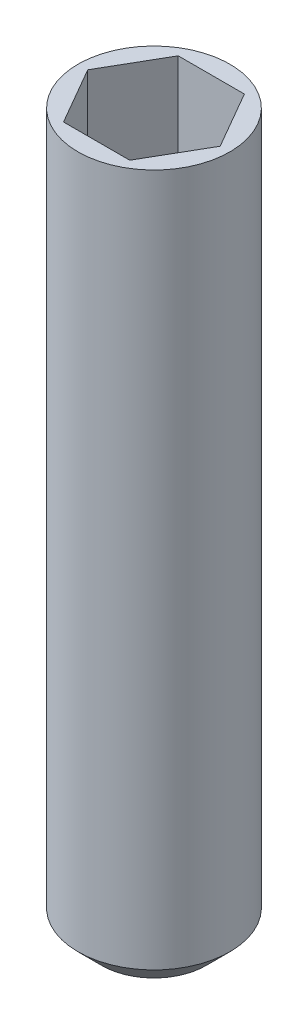
ISO-10303-21;
HEADER;
FILE_DESCRIPTION(('STEP AP214'),'2;1');
FILE_NAME('part.step','',(''),(''),'','','');
FILE_SCHEMA(('AUTOMOTIVE_DESIGN { 1 0 10303 214 1 1 1 1 }'));
ENDSEC;
DATA;
#1=APPLICATION_CONTEXT('core data for automotive mechanical design processes');
#2=APPLICATION_PROTOCOL_DEFINITION('international standard','automotive_design',2000,#1);
#3=PRODUCT_CONTEXT('',#1,'mechanical');
#4=PRODUCT('Part','Part','',(#3));
#5=PRODUCT_RELATED_PRODUCT_CATEGORY('part','',(#4));
#6=PRODUCT_DEFINITION_FORMATION('','',#4);
#7=PRODUCT_DEFINITION_CONTEXT('part definition',#1,'design');
#8=PRODUCT_DEFINITION('design','',#6,#7);
#9=PRODUCT_DEFINITION_SHAPE('','',#8);
#10=(LENGTH_UNIT() NAMED_UNIT(*) SI_UNIT(.MILLI.,.METRE.));
#11=(NAMED_UNIT(*) PLANE_ANGLE_UNIT() SI_UNIT($,.RADIAN.));
#12=(NAMED_UNIT(*) SI_UNIT($,.STERADIAN.) SOLID_ANGLE_UNIT());
#13=UNCERTAINTY_MEASURE_WITH_UNIT(LENGTH_MEASURE(1.E-05),#10,'distance_accuracy_value','');
#14=(GEOMETRIC_REPRESENTATION_CONTEXT(3) GLOBAL_UNCERTAINTY_ASSIGNED_CONTEXT((#13)) GLOBAL_UNIT_ASSIGNED_CONTEXT((#10,
#11,#12)) REPRESENTATION_CONTEXT('',''));
#15=CARTESIAN_POINT('',(0.,0.,0.));
#16=DIRECTION('',(0.,0.,1.));
#17=DIRECTION('',(1.,0.,0.));
#18=AXIS2_PLACEMENT_3D('',#15,#16,#17);
#19=CARTESIAN_POINT('',(0.,-19.05,0.));
#20=DIRECTION('',(0.,1.,0.));
#21=DIRECTION('',(0.,0.,1.));
#22=AXIS2_PLACEMENT_3D('',#19,#20,#21);
#23=CYLINDRICAL_SURFACE('',#22,2.0193);
#24=CARTESIAN_POINT('',(0.,-18.415,0.));
#25=DIRECTION('',(0.,1.,0.));
#26=DIRECTION('',(0.,0.,1.));
#27=AXIS2_PLACEMENT_3D('',#24,#25,#26);
#28=CIRCLE('',#27,2.0193);
#29=CARTESIAN_POINT('',(0.,-18.415,2.0193));
#30=VERTEX_POINT('',#29);
#31=EDGE_CURVE('E41',#30,#30,#28,.T.);
#32=CARTESIAN_POINT('',(0.,0.,0.));
#33=DIRECTION('',(0.,1.,0.));
#34=DIRECTION('',(0.,0.,1.));
#35=AXIS2_PLACEMENT_3D('',#32,#33,#34);
#36=CIRCLE('',#35,2.0193);
#37=CARTESIAN_POINT('',(0.,0.,2.0193));
#38=VERTEX_POINT('',#37);
#39=EDGE_CURVE('E135',#38,#38,#36,.T.);
#40=CARTESIAN_POINT('',(0.,-18.415,2.0193));
#41=CARTESIAN_POINT('',(0.,-18.2231770833333,2.0193));
#42=CARTESIAN_POINT('',(0.,-18.0313541666667,2.0193));
#43=CARTESIAN_POINT('',(0.,-17.6477083333333,2.0193));
#44=CARTESIAN_POINT('',(0.,-17.4558854166667,2.0193));
#45=CARTESIAN_POINT('',(0.,-17.0722395833333,2.0193));
#46=CARTESIAN_POINT('',(0.,-16.8804166666667,2.0193));
#47=CARTESIAN_POINT('',(0.,-16.4967708333333,2.0193));
#48=CARTESIAN_POINT('',(0.,-16.3049479166667,2.0193));
#49=CARTESIAN_POINT('',(0.,-15.9213020833333,2.0193));
#50=CARTESIAN_POINT('',(0.,-15.7294791666667,2.0193));
#51=CARTESIAN_POINT('',(0.,-15.3458333333333,2.0193));
#52=CARTESIAN_POINT('',(0.,-15.1540104166667,2.0193));
#53=CARTESIAN_POINT('',(0.,-14.7703645833333,2.0193));
#54=CARTESIAN_POINT('',(0.,-14.5785416666667,2.0193));
#55=CARTESIAN_POINT('',(0.,-14.1948958333333,2.0193));
#56=CARTESIAN_POINT('',(0.,-14.0030729166667,2.0193));
#57=CARTESIAN_POINT('',(0.,-13.6194270833333,2.0193));
#58=CARTESIAN_POINT('',(0.,-13.4276041666667,2.0193));
#59=CARTESIAN_POINT('',(0.,-13.0439583333333,2.0193));
#60=CARTESIAN_POINT('',(0.,-12.8521354166667,2.0193));
#61=CARTESIAN_POINT('',(0.,-12.4684895833333,2.0193));
#62=CARTESIAN_POINT('',(0.,-12.2766666666667,2.0193));
#63=CARTESIAN_POINT('',(0.,-11.8930208333333,2.0193));
#64=CARTESIAN_POINT('',(0.,-11.7011979166667,2.0193));
#65=CARTESIAN_POINT('',(0.,-11.3175520833333,2.0193));
#66=CARTESIAN_POINT('',(0.,-11.1257291666667,2.0193));
#67=CARTESIAN_POINT('',(0.,-10.7420833333333,2.0193));
#68=CARTESIAN_POINT('',(0.,-10.5502604166667,2.0193));
#69=CARTESIAN_POINT('',(0.,-10.1666145833333,2.0193));
#70=CARTESIAN_POINT('',(0.,-9.97479166666666,2.0193));
#71=CARTESIAN_POINT('',(0.,-9.59114583333333,2.0193));
#72=CARTESIAN_POINT('',(0.,-9.39932291666666,2.0193));
#73=CARTESIAN_POINT('',(0.,-9.01567708333333,2.0193));
#74=CARTESIAN_POINT('',(0.,-8.82385416666666,2.0193));
#75=CARTESIAN_POINT('',(0.,-8.44020833333333,2.0193));
#76=CARTESIAN_POINT('',(0.,-8.24838541666666,2.0193));
#77=CARTESIAN_POINT('',(0.,-7.86473958333333,2.0193));
#78=CARTESIAN_POINT('',(0.,-7.67291666666666,2.0193));
#79=CARTESIAN_POINT('',(0.,-7.28927083333333,2.0193));
#80=CARTESIAN_POINT('',(0.,-7.09744791666667,2.0193));
#81=CARTESIAN_POINT('',(0.,-6.71380208333333,2.0193));
#82=CARTESIAN_POINT('',(0.,-6.52197916666666,2.0193));
#83=CARTESIAN_POINT('',(0.,-6.13833333333333,2.0193));
#84=CARTESIAN_POINT('',(0.,-5.94651041666666,2.0193));
#85=CARTESIAN_POINT('',(0.,-5.56286458333333,2.0193));
#86=CARTESIAN_POINT('',(0.,-5.37104166666667,2.0193));
#87=CARTESIAN_POINT('',(0.,-4.98739583333333,2.0193));
#88=CARTESIAN_POINT('',(0.,-4.79557291666667,2.0193));
#89=CARTESIAN_POINT('',(0.,-4.41192708333333,2.0193));
#90=CARTESIAN_POINT('',(0.,-4.22010416666666,2.0193));
#91=CARTESIAN_POINT('',(0.,-3.83645833333333,2.0193));
#92=CARTESIAN_POINT('',(0.,-3.64463541666667,2.0193));
#93=CARTESIAN_POINT('',(0.,-3.26098958333333,2.0193));
#94=CARTESIAN_POINT('',(0.,-3.06916666666667,2.0193));
#95=CARTESIAN_POINT('',(0.,-2.68552083333333,2.0193));
#96=CARTESIAN_POINT('',(0.,-2.49369791666667,2.0193));
#97=CARTESIAN_POINT('',(0.,-2.11005208333333,2.0193));
#98=CARTESIAN_POINT('',(0.,-1.91822916666667,2.0193));
#99=CARTESIAN_POINT('',(0.,-1.53458333333333,2.0193));
#100=CARTESIAN_POINT('',(0.,-1.34276041666667,2.0193));
#101=CARTESIAN_POINT('',(0.,-0.959114583333334,2.0193));
#102=CARTESIAN_POINT('',(0.,-0.767291666666666,2.0193));
#103=CARTESIAN_POINT('',(0.,-0.383645833333332,2.0193));
#104=CARTESIAN_POINT('',(0.,-0.191822916666666,2.0193));
#105=CARTESIAN_POINT('',(0.,0.,2.0193));
#106=B_SPLINE_CURVE_WITH_KNOTS('',3,(#40,#41,#42,#43,#44,#45,#46,#47,#48,#49,#50,#51,#52,#53,
#54,#55,#56,#57,#58,#59,#60,#61,#62,#63,#64,#65,#66,#67,#68,#69,#70,#71,#72,#73,#74,#75,#76,#77,
#78,#79,#80,#81,#82,#83,#84,#85,#86,#87,#88,#89,#90,#91,#92,#93,#94,#95,#96,#97,#98,#99,#100,
#101,#102,#103,#104,#105),.UNSPECIFIED.,.F.,.F.,(4,2,2,2,2,2,2,2,2,2,2,2,2,2,2,2,2,2,2,2,2,2,2,
2,2,2,2,2,2,2,2,2,4),(0.,0.575468749999999,1.1509375,1.72640625,2.301875,2.87734375,3.4528125,
4.02828125,4.60375,5.17921875,5.75468749999999,6.33015625,6.905625,7.48109374999999,
8.05656249999999,8.63203124999999,9.20749999999999,9.78296874999999,10.3584375,10.93390625,
11.509375,12.08484375,12.6603125,13.23578125,13.81125,14.38671875,14.9621875,15.53765625,
16.113125,16.68859375,17.2640625,17.83953125,18.415),.UNSPECIFIED.);
#107=EDGE_CURVE('BSEAM33',#30,#38,#106,.T.);
#108=ORIENTED_EDGE('',*,*,#31,.T.);
#109=ORIENTED_EDGE('',*,*,#39,.F.);
#110=ORIENTED_EDGE('',*,*,#107,.T.);
#111=ORIENTED_EDGE('',*,*,#107,.F.);
#112=EDGE_LOOP('',(#108,#110,#109,#111));
#113=FACE_BOUND('',#112,.T.);
#114=ADVANCED_FACE('F33',(#113),#23,.T.);
#115=CARTESIAN_POINT('',(0.,-19.05,0.));
#116=DIRECTION('',(0.,1.,0.));
#117=DIRECTION('',(0.,0.,1.));
#118=AXIS2_PLACEMENT_3D('',#115,#116,#117);
#119=PLANE('',#118);
#120=CARTESIAN_POINT('',(0.,-19.05,0.));
#121=DIRECTION('',(0.,1.,0.));
#122=DIRECTION('',(0.,0.,1.));
#123=AXIS2_PLACEMENT_3D('',#120,#121,#122);
#124=CIRCLE('',#123,1.38429999999998);
#125=CARTESIAN_POINT('',(0.,-19.05,1.38429999999998));
#126=VERTEX_POINT('',#125);
#127=EDGE_CURVE('E11',#126,#126,#124,.F.);
#128=ORIENTED_EDGE('',*,*,#127,.T.);
#129=EDGE_LOOP('',(#128));
#130=FACE_BOUND('',#129,.T.);
#131=ADVANCED_FACE('F157',(#130),#119,.F.);
#132=CARTESIAN_POINT('',(0.,0.,0.));
#133=DIRECTION('',(0.,1.,0.));
#134=DIRECTION('',(0.,0.,1.));
#135=AXIS2_PLACEMENT_3D('',#132,#133,#134);
#136=PLANE('',#135);
#137=DIRECTION('',(-0.5,0.,0.866025403784438));
#138=VECTOR('',#137,1.);
#139=CARTESIAN_POINT('',(-0.87988181024499,0.,-1.524));
#140=LINE('',#139,#138);
#141=CARTESIAN_POINT('',(-0.87988181024499,0.,-1.524));
#142=VERTEX_POINT('',#141);
#143=CARTESIAN_POINT('',(-1.75976362048998,0.,0.));
#144=VERTEX_POINT('',#143);
#145=EDGE_CURVE('E48',#142,#144,#140,.T.);
#146=ORIENTED_EDGE('',*,*,#145,.F.);
#147=DIRECTION('',(-1.,0.,0.));
#148=VECTOR('',#147,1.);
#149=CARTESIAN_POINT('',(0.87988181024499,0.,-1.524));
#150=LINE('',#149,#148);
#151=CARTESIAN_POINT('',(0.87988181024499,0.,-1.524));
#152=VERTEX_POINT('',#151);
#153=EDGE_CURVE('E131',#152,#142,#150,.T.);
#154=ORIENTED_EDGE('',*,*,#153,.F.);
#155=DIRECTION('',(-0.5,0.,-0.866025403784439));
#156=VECTOR('',#155,1.);
#157=CARTESIAN_POINT('',(1.75976362048998,0.,0.));
#158=LINE('',#157,#156);
#159=CARTESIAN_POINT('',(1.75976362048998,0.,0.));
#160=VERTEX_POINT('',#159);
#161=EDGE_CURVE('E129',#160,#152,#158,.T.);
#162=ORIENTED_EDGE('',*,*,#161,.F.);
#163=DIRECTION('',(0.5,0.,-0.866025403784439));
#164=VECTOR('',#163,1.);
#165=CARTESIAN_POINT('',(0.879881810244989,0.,1.524));
#166=LINE('',#165,#164);
#167=CARTESIAN_POINT('',(0.879881810244989,0.,1.524));
#168=VERTEX_POINT('',#167);
#169=EDGE_CURVE('E96',#168,#160,#166,.T.);
#170=ORIENTED_EDGE('',*,*,#169,.F.);
#171=DIRECTION('',(1.,0.,0.));
#172=VECTOR('',#171,1.);
#173=CARTESIAN_POINT('',(-0.879881810244991,0.,1.524));
#174=LINE('',#173,#172);
#175=CARTESIAN_POINT('',(-0.879881810244991,0.,1.524));
#176=VERTEX_POINT('',#175);
#177=EDGE_CURVE('E125',#176,#168,#174,.T.);
#178=ORIENTED_EDGE('',*,*,#177,.F.);
#179=DIRECTION('',(0.5,0.,0.866025403784439));
#180=VECTOR('',#179,1.);
#181=CARTESIAN_POINT('',(-1.75976362048998,0.,0.));
#182=LINE('',#181,#180);
#183=EDGE_CURVE('E122',#144,#176,#182,.T.);
#184=ORIENTED_EDGE('',*,*,#183,.F.);
#185=EDGE_LOOP('',(#146,#154,#162,#170,#178,#184));
#186=FACE_BOUND('',#185,.T.);
#187=ORIENTED_EDGE('',*,*,#39,.T.);
#188=EDGE_LOOP('',(#187));
#189=FACE_BOUND('',#188,.T.);
#190=ADVANCED_FACE('F149',(#186,#189),#136,.T.);
#191=CARTESIAN_POINT('',(0.,-18.415,0.));
#192=DIRECTION('',(0.,1.,0.));
#193=DIRECTION('',(0.,0.,1.));
#194=AXIS2_PLACEMENT_3D('',#191,#192,#193);
#195=CONICAL_SURFACE('',#194,2.0193,0.785398163397454);
#196=ORIENTED_EDGE('',*,*,#127,.F.);
#197=EDGE_LOOP('',(#196));
#198=FACE_BOUND('',#197,.T.);
#199=ORIENTED_EDGE('',*,*,#31,.F.);
#200=EDGE_LOOP('',(#199));
#201=FACE_BOUND('',#200,.T.);
#202=ADVANCED_FACE('F35',(#198,#201),#195,.T.);
#203=CARTESIAN_POINT('',(-0.87988181024499,-2.54,-1.524));
#204=DIRECTION('',(-0.866025403784438,0.,-0.5));
#205=DIRECTION('',(-0.5,0.,0.866025403784439));
#206=AXIS2_PLACEMENT_3D('',#203,#204,#205);
#207=PLANE('',#206);
#208=ORIENTED_EDGE('',*,*,#145,.T.);
#209=DIRECTION('',(0.,1.,0.));
#210=VECTOR('',#209,1.);
#211=CARTESIAN_POINT('',(-1.75976362048998,-2.54,0.));
#212=LINE('',#211,#210);
#213=CARTESIAN_POINT('',(-1.75976362048998,-2.54,0.));
#214=VERTEX_POINT('',#213);
#215=EDGE_CURVE('E78',#214,#144,#212,.T.);
#216=ORIENTED_EDGE('',*,*,#215,.F.);
#217=DIRECTION('',(-0.5,0.,0.866025403784438));
#218=VECTOR('',#217,1.);
#219=CARTESIAN_POINT('',(-0.87988181024499,-2.54,-1.524));
#220=LINE('',#219,#218);
#221=CARTESIAN_POINT('',(-0.87988181024499,-2.54,-1.524));
#222=VERTEX_POINT('',#221);
#223=EDGE_CURVE('E133',#222,#214,#220,.T.);
#224=ORIENTED_EDGE('',*,*,#223,.F.);
#225=DIRECTION('',(0.,1.,0.));
#226=VECTOR('',#225,1.);
#227=CARTESIAN_POINT('',(-0.87988181024499,-2.54,-1.524));
#228=LINE('',#227,#226);
#229=EDGE_CURVE('E56',#222,#142,#228,.T.);
#230=ORIENTED_EDGE('',*,*,#229,.T.);
#231=EDGE_LOOP('',(#208,#216,#224,#230));
#232=FACE_BOUND('',#231,.T.);
#233=ADVANCED_FACE('F148',(#232),#207,.F.);
#234=CARTESIAN_POINT('',(0.87988181024499,-2.54,-1.524));
#235=DIRECTION('',(0.,0.,-1.));
#236=DIRECTION('',(-1.,0.,0.));
#237=AXIS2_PLACEMENT_3D('',#234,#235,#236);
#238=PLANE('',#237);
#239=ORIENTED_EDGE('',*,*,#153,.T.);
#240=ORIENTED_EDGE('',*,*,#229,.F.);
#241=DIRECTION('',(-1.,0.,0.));
#242=VECTOR('',#241,1.);
#243=CARTESIAN_POINT('',(0.87988181024499,-2.54,-1.524));
#244=LINE('',#243,#242);
#245=CARTESIAN_POINT('',(0.87988181024499,-2.54,-1.524));
#246=VERTEX_POINT('',#245);
#247=EDGE_CURVE('E108',#246,#222,#244,.T.);
#248=ORIENTED_EDGE('',*,*,#247,.F.);
#249=DIRECTION('',(0.,1.,0.));
#250=VECTOR('',#249,1.);
#251=CARTESIAN_POINT('',(0.87988181024499,-2.54,-1.524));
#252=LINE('',#251,#250);
#253=EDGE_CURVE('E100',#246,#152,#252,.T.);
#254=ORIENTED_EDGE('',*,*,#253,.T.);
#255=EDGE_LOOP('',(#239,#240,#248,#254));
#256=FACE_BOUND('',#255,.T.);
#257=ADVANCED_FACE('F155',(#256),#238,.F.);
#258=CARTESIAN_POINT('',(1.75976362048998,-2.54,0.));
#259=DIRECTION('',(0.866025403784439,0.,-0.5));
#260=DIRECTION('',(-0.5,0.,-0.866025403784439));
#261=AXIS2_PLACEMENT_3D('',#258,#259,#260);
#262=PLANE('',#261);
#263=ORIENTED_EDGE('',*,*,#161,.T.);
#264=ORIENTED_EDGE('',*,*,#253,.F.);
#265=DIRECTION('',(-0.5,0.,-0.866025403784439));
#266=VECTOR('',#265,1.);
#267=CARTESIAN_POINT('',(1.75976362048998,-2.54,0.));
#268=LINE('',#267,#266);
#269=CARTESIAN_POINT('',(1.75976362048998,-2.54,0.));
#270=VERTEX_POINT('',#269);
#271=EDGE_CURVE('E104',#270,#246,#268,.T.);
#272=ORIENTED_EDGE('',*,*,#271,.F.);
#273=DIRECTION('',(0.,1.,0.));
#274=VECTOR('',#273,1.);
#275=CARTESIAN_POINT('',(1.75976362048998,-2.54,0.));
#276=LINE('',#275,#274);
#277=EDGE_CURVE('E89',#270,#160,#276,.T.);
#278=ORIENTED_EDGE('',*,*,#277,.T.);
#279=EDGE_LOOP('',(#263,#264,#272,#278));
#280=FACE_BOUND('',#279,.T.);
#281=ADVANCED_FACE('F105',(#280),#262,.F.);
#282=CARTESIAN_POINT('',(0.879881810244989,-2.54,1.524));
#283=DIRECTION('',(0.866025403784439,0.,0.5));
#284=DIRECTION('',(0.5,0.,-0.866025403784439));
#285=AXIS2_PLACEMENT_3D('',#282,#283,#284);
#286=PLANE('',#285);
#287=ORIENTED_EDGE('',*,*,#169,.T.);
#288=ORIENTED_EDGE('',*,*,#277,.F.);
#289=DIRECTION('',(0.5,0.,-0.866025403784439));
#290=VECTOR('',#289,1.);
#291=CARTESIAN_POINT('',(0.879881810244989,-2.54,1.524));
#292=LINE('',#291,#290);
#293=CARTESIAN_POINT('',(0.879881810244989,-2.54,1.524));
#294=VERTEX_POINT('',#293);
#295=EDGE_CURVE('E93',#294,#270,#292,.T.);
#296=ORIENTED_EDGE('',*,*,#295,.F.);
#297=DIRECTION('',(0.,1.,0.));
#298=VECTOR('',#297,1.);
#299=CARTESIAN_POINT('',(0.879881810244989,-2.54,1.524));
#300=LINE('',#299,#298);
#301=EDGE_CURVE('E101',#294,#168,#300,.T.);
#302=ORIENTED_EDGE('',*,*,#301,.T.);
#303=EDGE_LOOP('',(#287,#288,#296,#302));
#304=FACE_BOUND('',#303,.T.);
#305=ADVANCED_FACE('F91',(#304),#286,.F.);
#306=CARTESIAN_POINT('',(-0.879881810244991,-2.54,1.524));
#307=DIRECTION('',(0.,0.,1.));
#308=DIRECTION('',(1.,0.,0.));
#309=AXIS2_PLACEMENT_3D('',#306,#307,#308);
#310=PLANE('',#309);
#311=ORIENTED_EDGE('',*,*,#177,.T.);
#312=ORIENTED_EDGE('',*,*,#301,.F.);
#313=DIRECTION('',(1.,0.,0.));
#314=VECTOR('',#313,1.);
#315=CARTESIAN_POINT('',(-0.879881810244991,-2.54,1.524));
#316=LINE('',#315,#314);
#317=CARTESIAN_POINT('',(-0.879881810244991,-2.54,1.524));
#318=VERTEX_POINT('',#317);
#319=EDGE_CURVE('E114',#318,#294,#316,.T.);
#320=ORIENTED_EDGE('',*,*,#319,.F.);
#321=DIRECTION('',(0.,1.,0.));
#322=VECTOR('',#321,1.);
#323=CARTESIAN_POINT('',(-0.879881810244991,-2.54,1.524));
#324=LINE('',#323,#322);
#325=EDGE_CURVE('E138',#318,#176,#324,.T.);
#326=ORIENTED_EDGE('',*,*,#325,.T.);
#327=EDGE_LOOP('',(#311,#312,#320,#326));
#328=FACE_BOUND('',#327,.T.);
#329=ADVANCED_FACE('F171',(#328),#310,.F.);
#330=CARTESIAN_POINT('',(-1.75976362048998,-2.54,0.));
#331=DIRECTION('',(-0.866025403784439,0.,0.5));
#332=DIRECTION('',(0.5,0.,0.866025403784439));
#333=AXIS2_PLACEMENT_3D('',#330,#331,#332);
#334=PLANE('',#333);
#335=ORIENTED_EDGE('',*,*,#183,.T.);
#336=ORIENTED_EDGE('',*,*,#325,.F.);
#337=DIRECTION('',(0.5,0.,0.866025403784439));
#338=VECTOR('',#337,1.);
#339=CARTESIAN_POINT('',(-1.75976362048998,-2.54,0.));
#340=LINE('',#339,#338);
#341=EDGE_CURVE('E116',#214,#318,#340,.T.);
#342=ORIENTED_EDGE('',*,*,#341,.F.);
#343=ORIENTED_EDGE('',*,*,#215,.T.);
#344=EDGE_LOOP('',(#335,#336,#342,#343));
#345=FACE_BOUND('',#344,.T.);
#346=ADVANCED_FACE('F168',(#345),#334,.F.);
#347=CARTESIAN_POINT('',(0.,-2.54,0.));
#348=DIRECTION('',(0.,1.,0.));
#349=DIRECTION('',(0.,0.,1.));
#350=AXIS2_PLACEMENT_3D('',#347,#348,#349);
#351=PLANE('',#350);
#352=ORIENTED_EDGE('',*,*,#223,.T.);
#353=ORIENTED_EDGE('',*,*,#341,.T.);
#354=ORIENTED_EDGE('',*,*,#319,.T.);
#355=ORIENTED_EDGE('',*,*,#295,.T.);
#356=ORIENTED_EDGE('',*,*,#271,.T.);
#357=ORIENTED_EDGE('',*,*,#247,.T.);
#358=EDGE_LOOP('',(#352,#353,#354,#355,#356,#357));
#359=FACE_BOUND('',#358,.T.);
#360=ADVANCED_FACE('F111',(#359),#351,.T.);
#361=CLOSED_SHELL('',(#114,#131,#190,#202,#233,#257,#281,#305,#329,#346,#360));
#362=MANIFOLD_SOLID_BREP('B2',#361);
#363=ADVANCED_BREP_SHAPE_REPRESENTATION('',(#18,#362),#14);
#364=SHAPE_DEFINITION_REPRESENTATION(#9,#363);
ENDSEC;
END-ISO-10303-21;
